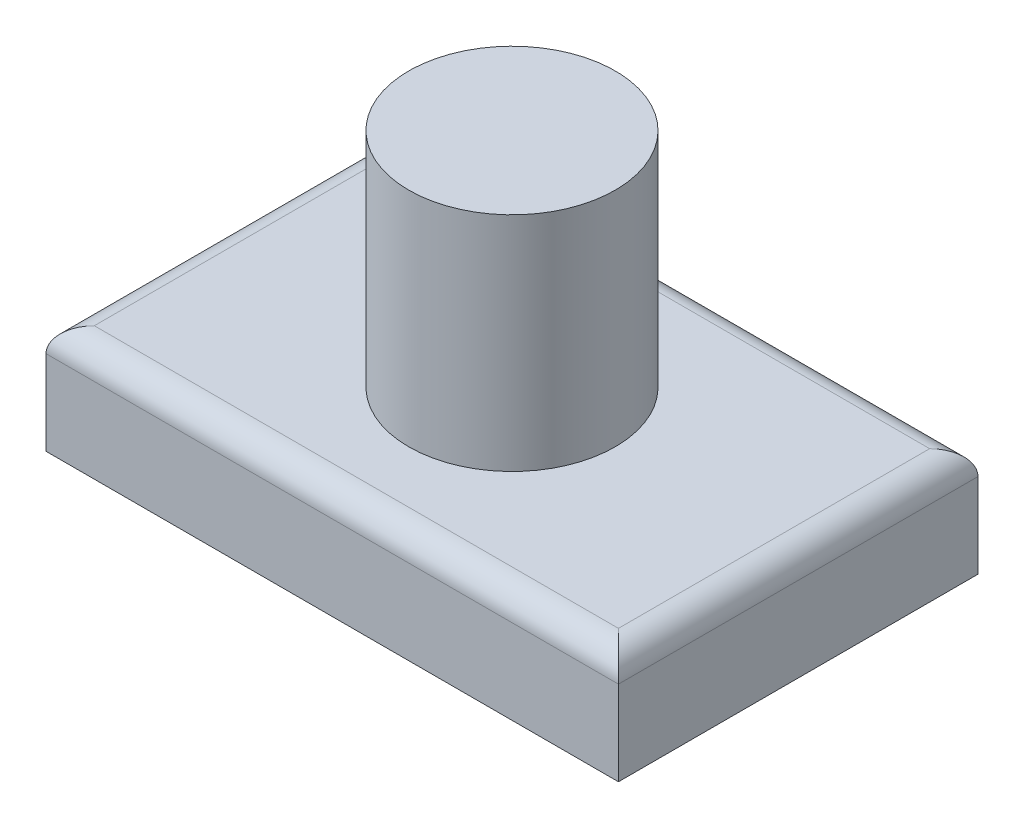
ISO-10303-21;
HEADER;
FILE_DESCRIPTION(('STEP AP214'),'2;1');
FILE_NAME('part.step','',(''),(''),'','','');
FILE_SCHEMA(('AUTOMOTIVE_DESIGN { 1 0 10303 214 1 1 1 1 }'));
ENDSEC;
DATA;
#1=APPLICATION_CONTEXT('core data for automotive mechanical design processes');
#2=APPLICATION_PROTOCOL_DEFINITION('international standard','automotive_design',2000,#1);
#3=PRODUCT_CONTEXT('',#1,'mechanical');
#4=PRODUCT('Part','Part','',(#3));
#5=PRODUCT_RELATED_PRODUCT_CATEGORY('part','',(#4));
#6=PRODUCT_DEFINITION_FORMATION('','',#4);
#7=PRODUCT_DEFINITION_CONTEXT('part definition',#1,'design');
#8=PRODUCT_DEFINITION('design','',#6,#7);
#9=PRODUCT_DEFINITION_SHAPE('','',#8);
#10=(LENGTH_UNIT() NAMED_UNIT(*) SI_UNIT(.MILLI.,.METRE.));
#11=(NAMED_UNIT(*) PLANE_ANGLE_UNIT() SI_UNIT($,.RADIAN.));
#12=(NAMED_UNIT(*) SI_UNIT($,.STERADIAN.) SOLID_ANGLE_UNIT());
#13=UNCERTAINTY_MEASURE_WITH_UNIT(LENGTH_MEASURE(1.E-05),#10,'distance_accuracy_value','');
#14=(GEOMETRIC_REPRESENTATION_CONTEXT(3) GLOBAL_UNCERTAINTY_ASSIGNED_CONTEXT((#13)) GLOBAL_UNIT_ASSIGNED_CONTEXT((#10,
#11,#12)) REPRESENTATION_CONTEXT('',''));
#15=CARTESIAN_POINT('',(0.,0.,0.));
#16=DIRECTION('',(0.,0.,1.));
#17=DIRECTION('',(1.,0.,0.));
#18=AXIS2_PLACEMENT_3D('',#15,#16,#17);
#19=CARTESIAN_POINT('',(-90.2642647419358,34.29,56.694910085844));
#20=DIRECTION('',(0.,0.,-1.));
#21=DIRECTION('',(-1.,0.,0.));
#22=AXIS2_PLACEMENT_3D('',#19,#20,#21);
#23=PLANE('',#22);
#24=DIRECTION('',(0.,-1.,0.));
#25=VECTOR('',#24,1.);
#26=CARTESIAN_POINT('',(90.2642647419358,34.29,56.694910085844));
#27=LINE('',#26,#25);
#28=CARTESIAN_POINT('',(90.2642647419358,26.67,56.694910085844));
#29=VERTEX_POINT('',#28);
#30=CARTESIAN_POINT('',(90.2642647419358,0.,56.694910085844));
#31=VERTEX_POINT('',#30);
#32=EDGE_CURVE('E88',#29,#31,#27,.T.);
#33=ORIENTED_EDGE('',*,*,#32,.F.);
#34=DIRECTION('',(1.,0.,0.));
#35=VECTOR('',#34,1.);
#36=CARTESIAN_POINT('',(-90.2642647419358,26.67,56.694910085844));
#37=LINE('',#36,#35);
#38=CARTESIAN_POINT('',(-90.2642647419358,26.67,56.694910085844));
#39=VERTEX_POINT('',#38);
#40=EDGE_CURVE('E12',#29,#39,#37,.F.);
#41=ORIENTED_EDGE('',*,*,#40,.T.);
#42=DIRECTION('',(0.,-1.,0.));
#43=VECTOR('',#42,1.);
#44=CARTESIAN_POINT('',(-90.2642647419358,34.29,56.694910085844));
#45=LINE('',#44,#43);
#46=CARTESIAN_POINT('',(-90.2642647419358,0.,56.694910085844));
#47=VERTEX_POINT('',#46);
#48=EDGE_CURVE('E102',#39,#47,#45,.T.);
#49=ORIENTED_EDGE('',*,*,#48,.T.);
#50=DIRECTION('',(1.,0.,0.));
#51=VECTOR('',#50,1.);
#52=CARTESIAN_POINT('',(-90.2642647419358,0.,56.694910085844));
#53=LINE('',#52,#51);
#54=EDGE_CURVE('E101',#47,#31,#53,.T.);
#55=ORIENTED_EDGE('',*,*,#54,.T.);
#56=EDGE_LOOP('',(#33,#41,#49,#55));
#57=FACE_BOUND('',#56,.T.);
#58=ADVANCED_FACE('F35',(#57),#23,.F.);
#59=CARTESIAN_POINT('',(90.2642647419358,34.29,-56.694910085844));
#60=DIRECTION('',(1.,0.,0.));
#61=DIRECTION('',(0.,0.,-1.));
#62=AXIS2_PLACEMENT_3D('',#59,#60,#61);
#63=PLANE('',#62);
#64=DIRECTION('',(0.,-1.,0.));
#65=VECTOR('',#64,1.);
#66=CARTESIAN_POINT('',(90.2642647419358,34.29,-56.694910085844));
#67=LINE('',#66,#65);
#68=CARTESIAN_POINT('',(90.2642647419358,26.67,-56.694910085844));
#69=VERTEX_POINT('',#68);
#70=CARTESIAN_POINT('',(90.2642647419358,0.,-56.694910085844));
#71=VERTEX_POINT('',#70);
#72=EDGE_CURVE('E98',#69,#71,#67,.T.);
#73=ORIENTED_EDGE('',*,*,#72,.F.);
#74=DIRECTION('',(0.,0.,1.));
#75=VECTOR('',#74,1.);
#76=CARTESIAN_POINT('',(90.2642647419358,26.67,56.694910085844));
#77=LINE('',#76,#75);
#78=EDGE_CURVE('E96',#69,#29,#77,.T.);
#79=ORIENTED_EDGE('',*,*,#78,.T.);
#80=ORIENTED_EDGE('',*,*,#32,.T.);
#81=DIRECTION('',(0.,0.,1.));
#82=VECTOR('',#81,1.);
#83=CARTESIAN_POINT('',(90.2642647419358,0.,-56.694910085844));
#84=LINE('',#83,#82);
#85=EDGE_CURVE('E93',#71,#31,#84,.T.);
#86=ORIENTED_EDGE('',*,*,#85,.F.);
#87=EDGE_LOOP('',(#73,#79,#80,#86));
#88=FACE_BOUND('',#87,.T.);
#89=ADVANCED_FACE('F91',(#88),#63,.T.);
#90=CARTESIAN_POINT('',(-90.2642647419358,34.29,-56.694910085844));
#91=DIRECTION('',(0.,0.,-1.));
#92=DIRECTION('',(-1.,0.,0.));
#93=AXIS2_PLACEMENT_3D('',#90,#91,#92);
#94=PLANE('',#93);
#95=DIRECTION('',(0.,-1.,0.));
#96=VECTOR('',#95,1.);
#97=CARTESIAN_POINT('',(-90.2642647419358,34.29,-56.694910085844));
#98=LINE('',#97,#96);
#99=CARTESIAN_POINT('',(-90.2642647419358,26.67,-56.694910085844));
#100=VERTEX_POINT('',#99);
#101=CARTESIAN_POINT('',(-90.2642647419358,0.,-56.694910085844));
#102=VERTEX_POINT('',#101);
#103=EDGE_CURVE('E118',#100,#102,#98,.T.);
#104=ORIENTED_EDGE('',*,*,#103,.F.);
#105=DIRECTION('',(1.,0.,0.));
#106=VECTOR('',#105,1.);
#107=CARTESIAN_POINT('',(90.2642647419358,26.67,-56.694910085844));
#108=LINE('',#107,#106);
#109=EDGE_CURVE('E131',#100,#69,#108,.T.);
#110=ORIENTED_EDGE('',*,*,#109,.T.);
#111=ORIENTED_EDGE('',*,*,#72,.T.);
#112=DIRECTION('',(1.,0.,0.));
#113=VECTOR('',#112,1.);
#114=CARTESIAN_POINT('',(-90.2642647419358,0.,-56.694910085844));
#115=LINE('',#114,#113);
#116=EDGE_CURVE('E110',#102,#71,#115,.T.);
#117=ORIENTED_EDGE('',*,*,#116,.F.);
#118=EDGE_LOOP('',(#104,#110,#111,#117));
#119=FACE_BOUND('',#118,.T.);
#120=ADVANCED_FACE('F166',(#119),#94,.T.);
#121=CARTESIAN_POINT('',(-90.2642647419358,34.29,-56.694910085844));
#122=DIRECTION('',(1.,0.,0.));
#123=DIRECTION('',(0.,0.,-1.));
#124=AXIS2_PLACEMENT_3D('',#121,#122,#123);
#125=PLANE('',#124);
#126=ORIENTED_EDGE('',*,*,#48,.F.);
#127=DIRECTION('',(0.,0.,1.));
#128=VECTOR('',#127,1.);
#129=CARTESIAN_POINT('',(-90.2642647419358,26.67,-56.694910085844));
#130=LINE('',#129,#128);
#131=EDGE_CURVE('E44',#39,#100,#130,.F.);
#132=ORIENTED_EDGE('',*,*,#131,.T.);
#133=ORIENTED_EDGE('',*,*,#103,.T.);
#134=DIRECTION('',(0.,0.,1.));
#135=VECTOR('',#134,1.);
#136=CARTESIAN_POINT('',(-90.2642647419358,0.,-56.694910085844));
#137=LINE('',#136,#135);
#138=EDGE_CURVE('E112',#102,#47,#137,.T.);
#139=ORIENTED_EDGE('',*,*,#138,.T.);
#140=EDGE_LOOP('',(#126,#132,#133,#139));
#141=FACE_BOUND('',#140,.T.);
#142=ADVANCED_FACE('F158',(#141),#125,.F.);
#143=CARTESIAN_POINT('',(0.,34.29,0.));
#144=DIRECTION('',(0.,-1.,0.));
#145=DIRECTION('',(0.,0.,-1.));
#146=AXIS2_PLACEMENT_3D('',#143,#144,#145);
#147=PLANE('',#146);
#148=DIRECTION('',(1.,0.,0.));
#149=VECTOR('',#148,1.);
#150=CARTESIAN_POINT('',(0.,34.29,49.074910085844));
#151=LINE('',#150,#149);
#152=CARTESIAN_POINT('',(-82.6442647419358,34.29,49.074910085844));
#153=VERTEX_POINT('',#152);
#154=CARTESIAN_POINT('',(82.6442647419358,34.29,49.074910085844));
#155=VERTEX_POINT('',#154);
#156=EDGE_CURVE('E122',#153,#155,#151,.T.);
#157=ORIENTED_EDGE('',*,*,#156,.T.);
#158=DIRECTION('',(0.,0.,1.));
#159=VECTOR('',#158,1.);
#160=CARTESIAN_POINT('',(82.6442647419358,34.29,-56.694910085844));
#161=LINE('',#160,#159);
#162=CARTESIAN_POINT('',(82.6442647419358,34.29,-49.074910085844));
#163=VERTEX_POINT('',#162);
#164=EDGE_CURVE('E128',#155,#163,#161,.F.);
#165=ORIENTED_EDGE('',*,*,#164,.T.);
#166=DIRECTION('',(1.,0.,0.));
#167=VECTOR('',#166,1.);
#168=CARTESIAN_POINT('',(-90.2642647419358,34.29,-49.074910085844));
#169=LINE('',#168,#167);
#170=CARTESIAN_POINT('',(-82.6442647419358,34.29,-49.074910085844));
#171=VERTEX_POINT('',#170);
#172=EDGE_CURVE('E126',#163,#171,#169,.F.);
#173=ORIENTED_EDGE('',*,*,#172,.T.);
#174=DIRECTION('',(0.,0.,1.));
#175=VECTOR('',#174,1.);
#176=CARTESIAN_POINT('',(-82.6442647419358,34.29,0.));
#177=LINE('',#176,#175);
#178=EDGE_CURVE('E124',#171,#153,#177,.T.);
#179=ORIENTED_EDGE('',*,*,#178,.T.);
#180=EDGE_LOOP('',(#157,#165,#173,#179));
#181=FACE_BOUND('',#180,.T.);
#182=CARTESIAN_POINT('',(0.,34.29,0.));
#183=DIRECTION('',(0.,1.,0.));
#184=DIRECTION('',(0.,0.,1.));
#185=AXIS2_PLACEMENT_3D('',#182,#183,#184);
#186=CIRCLE('',#185,32.5687009100664);
#187=CARTESIAN_POINT('',(0.,34.29,32.5687009100664));
#188=VERTEX_POINT('',#187);
#189=EDGE_CURVE('E97',#188,#188,#186,.T.);
#190=ORIENTED_EDGE('',*,*,#189,.F.);
#191=EDGE_LOOP('',(#190));
#192=FACE_BOUND('',#191,.T.);
#193=ADVANCED_FACE('F156',(#181,#192),#147,.F.);
#194=CARTESIAN_POINT('',(0.,0.,0.));
#195=DIRECTION('',(0.,-1.,0.));
#196=DIRECTION('',(0.,0.,-1.));
#197=AXIS2_PLACEMENT_3D('',#194,#195,#196);
#198=PLANE('',#197);
#199=ORIENTED_EDGE('',*,*,#54,.F.);
#200=ORIENTED_EDGE('',*,*,#138,.F.);
#201=ORIENTED_EDGE('',*,*,#116,.T.);
#202=ORIENTED_EDGE('',*,*,#85,.T.);
#203=EDGE_LOOP('',(#199,#200,#201,#202));
#204=FACE_BOUND('',#203,.T.);
#205=ADVANCED_FACE('F108',(#204),#198,.T.);
#206=CARTESIAN_POINT('',(0.,104.394,0.));
#207=DIRECTION('',(0.,-1.,0.));
#208=DIRECTION('',(0.,0.,-1.));
#209=AXIS2_PLACEMENT_3D('',#206,#207,#208);
#210=CYLINDRICAL_SURFACE('',#209,32.5687009100664);
#211=CARTESIAN_POINT('',(0.,104.394,0.));
#212=DIRECTION('',(0.,1.,0.));
#213=DIRECTION('',(0.,0.,1.));
#214=AXIS2_PLACEMENT_3D('',#211,#212,#213);
#215=CIRCLE('',#214,32.5687009100664);
#216=CARTESIAN_POINT('',(0.,104.394,32.5687009100664));
#217=VERTEX_POINT('',#216);
#218=EDGE_CURVE('E106',#217,#217,#215,.T.);
#219=ORIENTED_EDGE('',*,*,#218,.F.);
#220=EDGE_LOOP('',(#219));
#221=FACE_BOUND('',#220,.T.);
#222=ORIENTED_EDGE('',*,*,#189,.T.);
#223=EDGE_LOOP('',(#222));
#224=FACE_BOUND('',#223,.T.);
#225=ADVANCED_FACE('F154',(#221,#224),#210,.T.);
#226=CARTESIAN_POINT('',(0.,104.394,0.));
#227=DIRECTION('',(0.,1.,0.));
#228=DIRECTION('',(0.,0.,1.));
#229=AXIS2_PLACEMENT_3D('',#226,#227,#228);
#230=PLANE('',#229);
#231=ORIENTED_EDGE('',*,*,#218,.T.);
#232=EDGE_LOOP('',(#231));
#233=FACE_BOUND('',#232,.T.);
#234=ADVANCED_FACE('F188',(#233),#230,.T.);
#235=CARTESIAN_POINT('',(-82.6442647419358,26.67,0.));
#236=DIRECTION('',(0.,0.,1.));
#237=DIRECTION('',(1.,0.,0.));
#238=AXIS2_PLACEMENT_3D('',#235,#236,#237);
#239=CYLINDRICAL_SURFACE('',#238,7.62);
#240=CARTESIAN_POINT('',(-82.6442647419358,26.67,49.074910085844));
#241=DIRECTION('',(0.707106781186547,0.,0.707106781186547));
#242=DIRECTION('',(0.707106781186547,0.,-0.707106781186547));
#243=AXIS2_PLACEMENT_3D('',#240,#241,#242);
#244=ELLIPSE('',#243,10.776307345283,7.62);
#245=EDGE_CURVE('E137',#153,#39,#244,.T.);
#246=ORIENTED_EDGE('',*,*,#245,.F.);
#247=ORIENTED_EDGE('',*,*,#178,.F.);
#248=CARTESIAN_POINT('',(-82.6442647419358,26.67,-49.074910085844));
#249=DIRECTION('',(-0.707106781186547,0.,0.707106781186547));
#250=DIRECTION('',(0.707106781186547,0.,0.707106781186547));
#251=AXIS2_PLACEMENT_3D('',#248,#249,#250);
#252=ELLIPSE('',#251,10.776307345283,7.62);
#253=EDGE_CURVE('E39',#100,#171,#252,.F.);
#254=ORIENTED_EDGE('',*,*,#253,.F.);
#255=ORIENTED_EDGE('',*,*,#131,.F.);
#256=EDGE_LOOP('',(#246,#247,#254,#255));
#257=FACE_BOUND('',#256,.T.);
#258=ADVANCED_FACE('F37',(#257),#239,.T.);
#259=CARTESIAN_POINT('',(-90.2642647419358,26.67,-49.074910085844));
#260=DIRECTION('',(-1.,0.,0.));
#261=DIRECTION('',(0.,0.,1.));
#262=AXIS2_PLACEMENT_3D('',#259,#260,#261);
#263=CYLINDRICAL_SURFACE('',#262,7.62);
#264=ORIENTED_EDGE('',*,*,#253,.T.);
#265=ORIENTED_EDGE('',*,*,#172,.F.);
#266=CARTESIAN_POINT('',(82.6442647419358,26.67,-49.074910085844));
#267=DIRECTION('',(-0.707106781186547,0.,-0.707106781186547));
#268=DIRECTION('',(-0.707106781186547,0.,0.707106781186547));
#269=AXIS2_PLACEMENT_3D('',#266,#267,#268);
#270=ELLIPSE('',#269,10.776307345283,7.62);
#271=EDGE_CURVE('E136',#69,#163,#270,.F.);
#272=ORIENTED_EDGE('',*,*,#271,.F.);
#273=ORIENTED_EDGE('',*,*,#109,.F.);
#274=EDGE_LOOP('',(#264,#265,#272,#273));
#275=FACE_BOUND('',#274,.T.);
#276=ADVANCED_FACE('F183',(#275),#263,.T.);
#277=CARTESIAN_POINT('',(0.,26.67,49.074910085844));
#278=DIRECTION('',(1.,0.,0.));
#279=DIRECTION('',(0.,0.,-1.));
#280=AXIS2_PLACEMENT_3D('',#277,#278,#279);
#281=CYLINDRICAL_SURFACE('',#280,7.62);
#282=ORIENTED_EDGE('',*,*,#245,.T.);
#283=ORIENTED_EDGE('',*,*,#40,.F.);
#284=CARTESIAN_POINT('',(82.6442647419358,26.67,49.074910085844));
#285=DIRECTION('',(0.707106781186547,0.,-0.707106781186547));
#286=DIRECTION('',(0.707106781186547,0.,0.707106781186547));
#287=AXIS2_PLACEMENT_3D('',#284,#285,#286);
#288=ELLIPSE('',#287,10.776307345283,7.62);
#289=EDGE_CURVE('E134',#155,#29,#288,.T.);
#290=ORIENTED_EDGE('',*,*,#289,.F.);
#291=ORIENTED_EDGE('',*,*,#156,.F.);
#292=EDGE_LOOP('',(#282,#283,#290,#291));
#293=FACE_BOUND('',#292,.T.);
#294=ADVANCED_FACE('F180',(#293),#281,.T.);
#295=CARTESIAN_POINT('',(82.6442647419358,26.67,-56.694910085844));
#296=DIRECTION('',(0.,0.,-1.));
#297=DIRECTION('',(-1.,0.,0.));
#298=AXIS2_PLACEMENT_3D('',#295,#296,#297);
#299=CYLINDRICAL_SURFACE('',#298,7.62);
#300=ORIENTED_EDGE('',*,*,#271,.T.);
#301=ORIENTED_EDGE('',*,*,#164,.F.);
#302=ORIENTED_EDGE('',*,*,#289,.T.);
#303=ORIENTED_EDGE('',*,*,#78,.F.);
#304=EDGE_LOOP('',(#300,#301,#302,#303));
#305=FACE_BOUND('',#304,.T.);
#306=ADVANCED_FACE('F177',(#305),#299,.T.);
#307=CLOSED_SHELL('',(#58,#89,#120,#142,#193,#205,#225,#234,#258,#276,#294,#306));
#308=MANIFOLD_SOLID_BREP('B2',#307);
#309=ADVANCED_BREP_SHAPE_REPRESENTATION('',(#18,#308),#14);
#310=SHAPE_DEFINITION_REPRESENTATION(#9,#309);
ENDSEC;
END-ISO-10303-21;
